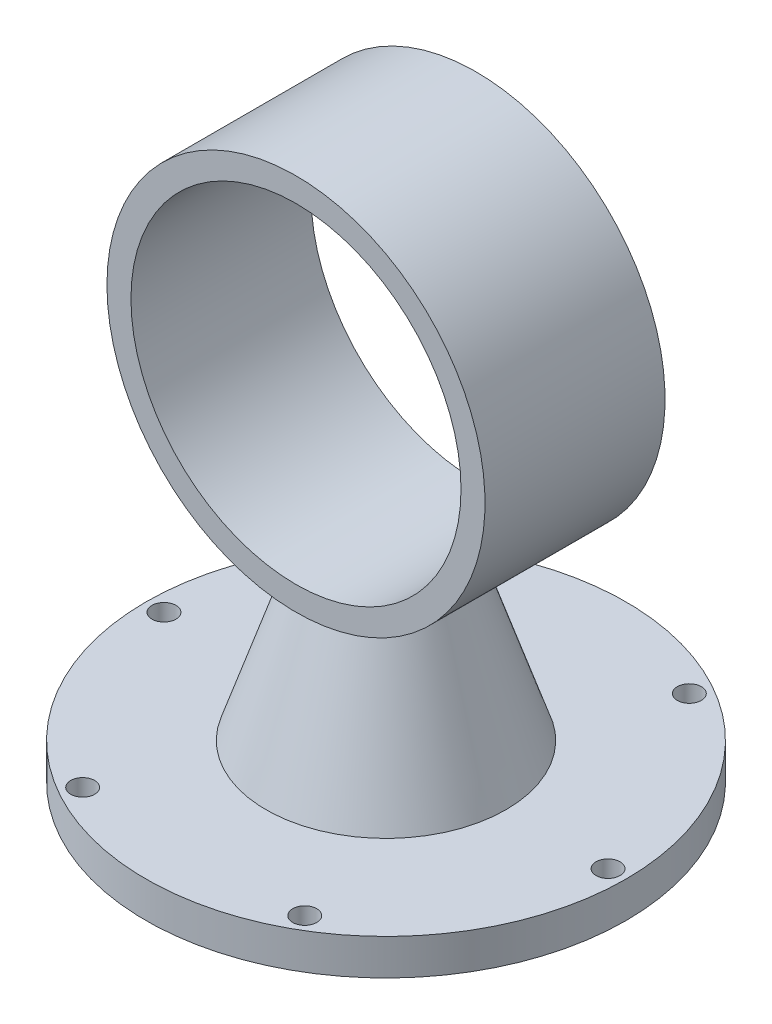
ISO-10303-21;
HEADER;
FILE_DESCRIPTION(('STEP AP214'),'2;1');
FILE_NAME('part.step','',(''),(''),'','','');
FILE_SCHEMA(('AUTOMOTIVE_DESIGN { 1 0 10303 214 1 1 1 1 }'));
ENDSEC;
DATA;
#1=APPLICATION_CONTEXT('core data for automotive mechanical design processes');
#2=APPLICATION_PROTOCOL_DEFINITION('international standard','automotive_design',2000,#1);
#3=PRODUCT_CONTEXT('',#1,'mechanical');
#4=PRODUCT('Part','Part','',(#3));
#5=PRODUCT_RELATED_PRODUCT_CATEGORY('part','',(#4));
#6=PRODUCT_DEFINITION_FORMATION('','',#4);
#7=PRODUCT_DEFINITION_CONTEXT('part definition',#1,'design');
#8=PRODUCT_DEFINITION('design','',#6,#7);
#9=PRODUCT_DEFINITION_SHAPE('','',#8);
#10=(LENGTH_UNIT() NAMED_UNIT(*) SI_UNIT(.MILLI.,.METRE.));
#11=(NAMED_UNIT(*) PLANE_ANGLE_UNIT() SI_UNIT($,.RADIAN.));
#12=(NAMED_UNIT(*) SI_UNIT($,.STERADIAN.) SOLID_ANGLE_UNIT());
#13=UNCERTAINTY_MEASURE_WITH_UNIT(LENGTH_MEASURE(1.E-05),#10,'distance_accuracy_value','');
#14=(GEOMETRIC_REPRESENTATION_CONTEXT(3) GLOBAL_UNCERTAINTY_ASSIGNED_CONTEXT((#13)) GLOBAL_UNIT_ASSIGNED_CONTEXT((#10,
#11,#12)) REPRESENTATION_CONTEXT('',''));
#15=CARTESIAN_POINT('',(0.,0.,0.));
#16=DIRECTION('',(0.,0.,1.));
#17=DIRECTION('',(1.,0.,0.));
#18=AXIS2_PLACEMENT_3D('',#15,#16,#17);
#19=CARTESIAN_POINT('',(0.,0.,0.));
#20=DIRECTION('',(0.,1.,0.));
#21=DIRECTION('',(1.,0.,0.));
#22=AXIS2_PLACEMENT_3D('',#19,#20,#21);
#23=PLANE('',#22);
#24=CARTESIAN_POINT('',(-18.5,0.,-32.0429399400242));
#25=DIRECTION('',(0.,1.,0.));
#26=DIRECTION('',(1.,0.,0.));
#27=AXIS2_PLACEMENT_3D('',#24,#25,#26);
#28=CIRCLE('',#27,2.);
#29=CARTESIAN_POINT('',(-20.5,0.,-32.0429399400242));
#30=VERTEX_POINT('',#29);
#31=EDGE_CURVE('E159',#30,#30,#28,.T.);
#32=ORIENTED_EDGE('',*,*,#31,.T.);
#33=EDGE_LOOP('',(#32));
#34=FACE_BOUND('',#33,.T.);
#35=CARTESIAN_POINT('',(-18.5,0.,32.0429399400242));
#36=DIRECTION('',(0.,1.,0.));
#37=DIRECTION('',(1.,0.,0.));
#38=AXIS2_PLACEMENT_3D('',#35,#36,#37);
#39=CIRCLE('',#38,2.);
#40=CARTESIAN_POINT('',(-20.5,0.,32.0429399400242));
#41=VERTEX_POINT('',#40);
#42=EDGE_CURVE('E104',#41,#41,#39,.T.);
#43=ORIENTED_EDGE('',*,*,#42,.T.);
#44=EDGE_LOOP('',(#43));
#45=FACE_BOUND('',#44,.T.);
#46=CARTESIAN_POINT('',(37.,0.,0.));
#47=DIRECTION('',(0.,1.,0.));
#48=DIRECTION('',(1.,0.,0.));
#49=AXIS2_PLACEMENT_3D('',#46,#47,#48);
#50=CIRCLE('',#49,2.);
#51=CARTESIAN_POINT('',(35.,0.,0.));
#52=VERTEX_POINT('',#51);
#53=EDGE_CURVE('E185',#52,#52,#50,.T.);
#54=ORIENTED_EDGE('',*,*,#53,.T.);
#55=EDGE_LOOP('',(#54));
#56=FACE_BOUND('',#55,.T.);
#57=CARTESIAN_POINT('',(18.5,0.,-32.0429399400242));
#58=DIRECTION('',(0.,1.,0.));
#59=DIRECTION('',(1.,0.,0.));
#60=AXIS2_PLACEMENT_3D('',#57,#58,#59);
#61=CIRCLE('',#60,2.);
#62=CARTESIAN_POINT('',(16.5,0.,-32.0429399400242));
#63=VERTEX_POINT('',#62);
#64=EDGE_CURVE('E74',#63,#63,#61,.T.);
#65=ORIENTED_EDGE('',*,*,#64,.T.);
#66=EDGE_LOOP('',(#65));
#67=FACE_BOUND('',#66,.T.);
#68=CARTESIAN_POINT('',(-37.,0.,0.));
#69=DIRECTION('',(0.,1.,0.));
#70=DIRECTION('',(1.,0.,0.));
#71=AXIS2_PLACEMENT_3D('',#68,#69,#70);
#72=CIRCLE('',#71,2.);
#73=CARTESIAN_POINT('',(-39.,0.,0.));
#74=VERTEX_POINT('',#73);
#75=EDGE_CURVE('E171',#74,#74,#72,.T.);
#76=ORIENTED_EDGE('',*,*,#75,.T.);
#77=EDGE_LOOP('',(#76));
#78=FACE_BOUND('',#77,.T.);
#79=CARTESIAN_POINT('',(18.5,0.,32.0429399400242));
#80=DIRECTION('',(0.,1.,0.));
#81=DIRECTION('',(1.,0.,0.));
#82=AXIS2_PLACEMENT_3D('',#79,#80,#81);
#83=CIRCLE('',#82,2.);
#84=CARTESIAN_POINT('',(16.5,0.,32.0429399400242));
#85=VERTEX_POINT('',#84);
#86=EDGE_CURVE('E173',#85,#85,#83,.T.);
#87=ORIENTED_EDGE('',*,*,#86,.T.);
#88=EDGE_LOOP('',(#87));
#89=FACE_BOUND('',#88,.T.);
#90=CARTESIAN_POINT('',(0.,0.,0.));
#91=DIRECTION('',(0.,1.,0.));
#92=DIRECTION('',(-1.,0.,0.));
#93=AXIS2_PLACEMENT_3D('',#90,#91,#92);
#94=CIRCLE('',#93,40.);
#95=CARTESIAN_POINT('',(40.,0.,0.));
#96=VERTEX_POINT('',#95);
#97=EDGE_CURVE('E11',#96,#96,#94,.T.);
#98=ORIENTED_EDGE('',*,*,#97,.F.);
#99=EDGE_LOOP('',(#98));
#100=FACE_BOUND('',#99,.T.);
#101=ADVANCED_FACE('F17',(#34,#45,#56,#67,#78,#89,#100),#23,.F.);
#102=CARTESIAN_POINT('',(0.,6.,0.));
#103=DIRECTION('',(0.,1.,0.));
#104=DIRECTION('',(1.,0.,0.));
#105=AXIS2_PLACEMENT_3D('',#102,#103,#104);
#106=PLANE('',#105);
#107=CARTESIAN_POINT('',(-18.5,6.,-32.0429399400242));
#108=DIRECTION('',(0.,-1.,0.));
#109=DIRECTION('',(1.,0.,0.));
#110=AXIS2_PLACEMENT_3D('',#107,#108,#109);
#111=CIRCLE('',#110,2.);
#112=CARTESIAN_POINT('',(-20.5,6.,-32.0429399400242));
#113=VERTEX_POINT('',#112);
#114=EDGE_CURVE('E157',#113,#113,#111,.T.);
#115=ORIENTED_EDGE('',*,*,#114,.T.);
#116=EDGE_LOOP('',(#115));
#117=FACE_BOUND('',#116,.T.);
#118=CARTESIAN_POINT('',(-18.5,6.,32.0429399400242));
#119=DIRECTION('',(0.,-1.,0.));
#120=DIRECTION('',(1.,0.,0.));
#121=AXIS2_PLACEMENT_3D('',#118,#119,#120);
#122=CIRCLE('',#121,2.);
#123=CARTESIAN_POINT('',(-20.5,6.,32.0429399400242));
#124=VERTEX_POINT('',#123);
#125=EDGE_CURVE('E182',#124,#124,#122,.T.);
#126=ORIENTED_EDGE('',*,*,#125,.T.);
#127=EDGE_LOOP('',(#126));
#128=FACE_BOUND('',#127,.T.);
#129=CARTESIAN_POINT('',(37.,6.,0.));
#130=DIRECTION('',(0.,-1.,0.));
#131=DIRECTION('',(1.,0.,0.));
#132=AXIS2_PLACEMENT_3D('',#129,#130,#131);
#133=CIRCLE('',#132,2.);
#134=CARTESIAN_POINT('',(35.,6.,0.));
#135=VERTEX_POINT('',#134);
#136=EDGE_CURVE('E192',#135,#135,#133,.T.);
#137=ORIENTED_EDGE('',*,*,#136,.T.);
#138=EDGE_LOOP('',(#137));
#139=FACE_BOUND('',#138,.T.);
#140=CARTESIAN_POINT('',(18.5,6.,-32.0429399400242));
#141=DIRECTION('',(0.,-1.,0.));
#142=DIRECTION('',(1.,0.,0.));
#143=AXIS2_PLACEMENT_3D('',#140,#141,#142);
#144=CIRCLE('',#143,2.);
#145=CARTESIAN_POINT('',(16.5,6.,-32.0429399400242));
#146=VERTEX_POINT('',#145);
#147=EDGE_CURVE('E189',#146,#146,#144,.T.);
#148=ORIENTED_EDGE('',*,*,#147,.T.);
#149=EDGE_LOOP('',(#148));
#150=FACE_BOUND('',#149,.T.);
#151=CARTESIAN_POINT('',(-37.,6.,0.));
#152=DIRECTION('',(0.,-1.,0.));
#153=DIRECTION('',(1.,0.,0.));
#154=AXIS2_PLACEMENT_3D('',#151,#152,#153);
#155=CIRCLE('',#154,2.);
#156=CARTESIAN_POINT('',(-39.,6.,0.));
#157=VERTEX_POINT('',#156);
#158=EDGE_CURVE('E172',#157,#157,#155,.T.);
#159=ORIENTED_EDGE('',*,*,#158,.T.);
#160=EDGE_LOOP('',(#159));
#161=FACE_BOUND('',#160,.T.);
#162=CARTESIAN_POINT('',(18.5,6.,32.0429399400242));
#163=DIRECTION('',(0.,-1.,0.));
#164=DIRECTION('',(1.,0.,0.));
#165=AXIS2_PLACEMENT_3D('',#162,#163,#164);
#166=CIRCLE('',#165,2.);
#167=CARTESIAN_POINT('',(16.5,6.,32.0429399400242));
#168=VERTEX_POINT('',#167);
#169=EDGE_CURVE('E180',#168,#168,#166,.T.);
#170=ORIENTED_EDGE('',*,*,#169,.T.);
#171=EDGE_LOOP('',(#170));
#172=FACE_BOUND('',#171,.T.);
#173=CARTESIAN_POINT('',(0.,6.,0.));
#174=DIRECTION('',(0.,-1.,0.));
#175=DIRECTION('',(-1.,0.,0.));
#176=AXIS2_PLACEMENT_3D('',#173,#174,#175);
#177=CIRCLE('',#176,20.);
#178=CARTESIAN_POINT('',(20.,6.,0.));
#179=VERTEX_POINT('',#178);
#180=EDGE_CURVE('E177',#179,#179,#177,.T.);
#181=ORIENTED_EDGE('',*,*,#180,.T.);
#182=EDGE_LOOP('',(#181));
#183=FACE_BOUND('',#182,.T.);
#184=CARTESIAN_POINT('',(0.,6.,0.));
#185=DIRECTION('',(0.,1.,0.));
#186=DIRECTION('',(-1.,0.,0.));
#187=AXIS2_PLACEMENT_3D('',#184,#185,#186);
#188=CIRCLE('',#187,40.);
#189=CARTESIAN_POINT('',(40.,6.,0.));
#190=VERTEX_POINT('',#189);
#191=EDGE_CURVE('E162',#190,#190,#188,.T.);
#192=ORIENTED_EDGE('',*,*,#191,.T.);
#193=EDGE_LOOP('',(#192));
#194=FACE_BOUND('',#193,.T.);
#195=ADVANCED_FACE('F432',(#117,#128,#139,#150,#161,#172,#183,#194),#106,.T.);
#196=CARTESIAN_POINT('',(0.,0.,0.));
#197=DIRECTION('',(0.,1.,0.));
#198=DIRECTION('',(-1.,0.,0.));
#199=AXIS2_PLACEMENT_3D('',#196,#197,#198);
#200=CYLINDRICAL_SURFACE('',#199,40.);
#201=ORIENTED_EDGE('',*,*,#191,.F.);
#202=DIRECTION('',(0.,-1.,0.));
#203=VECTOR('',#202,1.);
#204=CARTESIAN_POINT('',(40.,0.,0.));
#205=LINE('',#204,#203);
#206=EDGE_CURVE('E28',#190,#96,#205,.T.);
#207=ORIENTED_EDGE('',*,*,#206,.T.);
#208=ORIENTED_EDGE('',*,*,#97,.T.);
#209=ORIENTED_EDGE('',*,*,#206,.F.);
#210=EDGE_LOOP('',(#201,#207,#208,#209));
#211=FACE_BOUND('',#210,.T.);
#212=ADVANCED_FACE('F260',(#211),#200,.T.);
#213=CARTESIAN_POINT('',(-18.5,6.,-32.0429399400242));
#214=DIRECTION('',(0.,-1.,0.));
#215=DIRECTION('',(1.,0.,0.));
#216=AXIS2_PLACEMENT_3D('',#213,#214,#215);
#217=CYLINDRICAL_SURFACE('',#216,2.);
#218=ORIENTED_EDGE('',*,*,#114,.F.);
#219=DIRECTION('',(0.,-1.,0.));
#220=VECTOR('',#219,1.);
#221=CARTESIAN_POINT('',(-20.5,6.,-32.0429399400242));
#222=LINE('',#221,#220);
#223=EDGE_CURVE('E163',#113,#30,#222,.T.);
#224=ORIENTED_EDGE('',*,*,#223,.T.);
#225=ORIENTED_EDGE('',*,*,#31,.F.);
#226=ORIENTED_EDGE('',*,*,#223,.F.);
#227=EDGE_LOOP('',(#218,#224,#225,#226));
#228=FACE_BOUND('',#227,.T.);
#229=ADVANCED_FACE('F19',(#228),#217,.F.);
#230=CARTESIAN_POINT('',(-18.5,6.,32.0429399400242));
#231=DIRECTION('',(0.,-1.,0.));
#232=DIRECTION('',(1.,0.,0.));
#233=AXIS2_PLACEMENT_3D('',#230,#231,#232);
#234=CYLINDRICAL_SURFACE('',#233,2.);
#235=ORIENTED_EDGE('',*,*,#125,.F.);
#236=DIRECTION('',(0.,-1.,0.));
#237=VECTOR('',#236,1.);
#238=CARTESIAN_POINT('',(-20.5,6.,32.0429399400242));
#239=LINE('',#238,#237);
#240=EDGE_CURVE('E97',#124,#41,#239,.T.);
#241=ORIENTED_EDGE('',*,*,#240,.T.);
#242=ORIENTED_EDGE('',*,*,#42,.F.);
#243=ORIENTED_EDGE('',*,*,#240,.F.);
#244=EDGE_LOOP('',(#235,#241,#242,#243));
#245=FACE_BOUND('',#244,.T.);
#246=ADVANCED_FACE('F407',(#245),#234,.F.);
#247=CARTESIAN_POINT('',(37.,6.,0.));
#248=DIRECTION('',(0.,-1.,0.));
#249=DIRECTION('',(1.,0.,0.));
#250=AXIS2_PLACEMENT_3D('',#247,#248,#249);
#251=CYLINDRICAL_SURFACE('',#250,2.);
#252=ORIENTED_EDGE('',*,*,#136,.F.);
#253=DIRECTION('',(0.,-1.,0.));
#254=VECTOR('',#253,1.);
#255=CARTESIAN_POINT('',(35.,6.,0.));
#256=LINE('',#255,#254);
#257=EDGE_CURVE('E61',#135,#52,#256,.T.);
#258=ORIENTED_EDGE('',*,*,#257,.T.);
#259=ORIENTED_EDGE('',*,*,#53,.F.);
#260=ORIENTED_EDGE('',*,*,#257,.F.);
#261=EDGE_LOOP('',(#252,#258,#259,#260));
#262=FACE_BOUND('',#261,.T.);
#263=ADVANCED_FACE('F398',(#262),#251,.F.);
#264=CARTESIAN_POINT('',(18.5,6.,-32.0429399400242));
#265=DIRECTION('',(0.,-1.,0.));
#266=DIRECTION('',(1.,0.,0.));
#267=AXIS2_PLACEMENT_3D('',#264,#265,#266);
#268=CYLINDRICAL_SURFACE('',#267,2.);
#269=ORIENTED_EDGE('',*,*,#147,.F.);
#270=DIRECTION('',(0.,-1.,0.));
#271=VECTOR('',#270,1.);
#272=CARTESIAN_POINT('',(16.5,6.,-32.0429399400242));
#273=LINE('',#272,#271);
#274=EDGE_CURVE('E193',#146,#63,#273,.T.);
#275=ORIENTED_EDGE('',*,*,#274,.T.);
#276=ORIENTED_EDGE('',*,*,#64,.F.);
#277=ORIENTED_EDGE('',*,*,#274,.F.);
#278=EDGE_LOOP('',(#269,#275,#276,#277));
#279=FACE_BOUND('',#278,.T.);
#280=ADVANCED_FACE('F390',(#279),#268,.F.);
#281=CARTESIAN_POINT('',(-37.,6.,0.));
#282=DIRECTION('',(0.,-1.,0.));
#283=DIRECTION('',(1.,0.,0.));
#284=AXIS2_PLACEMENT_3D('',#281,#282,#283);
#285=CYLINDRICAL_SURFACE('',#284,2.);
#286=ORIENTED_EDGE('',*,*,#158,.F.);
#287=DIRECTION('',(0.,-1.,0.));
#288=VECTOR('',#287,1.);
#289=CARTESIAN_POINT('',(-39.,6.,0.));
#290=LINE('',#289,#288);
#291=EDGE_CURVE('E167',#157,#74,#290,.T.);
#292=ORIENTED_EDGE('',*,*,#291,.T.);
#293=ORIENTED_EDGE('',*,*,#75,.F.);
#294=ORIENTED_EDGE('',*,*,#291,.F.);
#295=EDGE_LOOP('',(#286,#292,#293,#294));
#296=FACE_BOUND('',#295,.T.);
#297=ADVANCED_FACE('F382',(#296),#285,.F.);
#298=CARTESIAN_POINT('',(18.5,6.,32.0429399400242));
#299=DIRECTION('',(0.,-1.,0.));
#300=DIRECTION('',(1.,0.,0.));
#301=AXIS2_PLACEMENT_3D('',#298,#299,#300);
#302=CYLINDRICAL_SURFACE('',#301,2.);
#303=ORIENTED_EDGE('',*,*,#169,.F.);
#304=DIRECTION('',(0.,-1.,0.));
#305=VECTOR('',#304,1.);
#306=CARTESIAN_POINT('',(16.5,6.,32.0429399400242));
#307=LINE('',#306,#305);
#308=EDGE_CURVE('E176',#168,#85,#307,.T.);
#309=ORIENTED_EDGE('',*,*,#308,.T.);
#310=ORIENTED_EDGE('',*,*,#86,.F.);
#311=ORIENTED_EDGE('',*,*,#308,.F.);
#312=EDGE_LOOP('',(#303,#309,#310,#311));
#313=FACE_BOUND('',#312,.T.);
#314=ADVANCED_FACE('F253',(#313),#302,.F.);
#315=CARTESIAN_POINT('',(0.,6.,0.));
#316=DIRECTION('',(0.,-1.,0.));
#317=DIRECTION('',(-1.,0.,0.));
#318=AXIS2_PLACEMENT_3D('',#315,#316,#317);
#319=CONICAL_SURFACE('',#318,20.,0.321750554396642);
#320=CARTESIAN_POINT('',(10.7080369551433,33.87588913457,0.));
#321=CARTESIAN_POINT('',(10.7080479333256,33.8758969891876,-0.177313396426435));
#322=CARTESIAN_POINT('',(10.7039544795907,33.8744135664368,-0.354617784798326));
#323=CARTESIAN_POINT('',(10.6876839746074,33.8685378655107,-0.709893767923769));
#324=CARTESIAN_POINT('',(10.6754577185806,33.8641278815491,-0.887862826354064));
#325=CARTESIAN_POINT('',(10.6429149962225,33.8524259928667,-1.24446570555335));
#326=CARTESIAN_POINT('',(10.6225316174449,33.8451102562178,-1.42309260658845));
#327=CARTESIAN_POINT('',(10.5736827137138,33.8276573951931,-1.78101652155944));
#328=CARTESIAN_POINT('',(10.5451342700297,33.8174913470375,-1.96030075561625));
#329=CARTESIAN_POINT('',(10.4794533992677,33.7942378037403,-2.32214589508347));
#330=CARTESIAN_POINT('',(10.4421091528123,33.7810785496381,-2.5046637838858));
#331=CARTESIAN_POINT('',(10.3594326453293,33.7521588095219,-2.86611501958995));
#332=CARTESIAN_POINT('',(10.3141674151128,33.7364202168213,-3.04506541731318));
#333=CARTESIAN_POINT('',(10.2156392979247,33.7024596088921,-3.39938358085693));
#334=CARTESIAN_POINT('',(10.1624244665341,33.6842525727717,-3.57476613188797));
#335=CARTESIAN_POINT('',(10.0479617341909,33.6454844005399,-3.9219466967298));
#336=CARTESIAN_POINT('',(9.9867422790348,33.6249316318058,-4.09375501746719));
#337=CARTESIAN_POINT('',(9.85634343769173,33.5816577841838,-4.43366498414948));
#338=CARTESIAN_POINT('',(9.78717937091566,33.5589408922993,-4.60177304305617));
#339=CARTESIAN_POINT('',(9.64068853419484,33.5114508260181,-4.93507589125284));
#340=CARTESIAN_POINT('',(9.56332412589944,33.4866682923816,-5.10025279289075));
#341=CARTESIAN_POINT('',(9.40038442822314,33.4352345488367,-5.4276989529024));
#342=CARTESIAN_POINT('',(9.31475472834476,33.4085713178033,-5.58993923070465));
#343=CARTESIAN_POINT('',(9.13524422146725,33.3535872583253,-5.91152271644954));
#344=CARTESIAN_POINT('',(9.04129405048143,33.3252533142561,-6.0708249185582));
#345=CARTESIAN_POINT('',(8.84912433414232,33.2683485272608,-6.38007952800198));
#346=CARTESIAN_POINT('',(8.75111584477607,33.2398099830988,-6.53016908641889));
#347=CARTESIAN_POINT('',(8.54928010435424,33.1821717168339,-6.82406627016287));
#348=CARTESIAN_POINT('',(8.44551917498165,33.1530802184825,-6.96792099419677));
#349=CARTESIAN_POINT('',(8.23215702957989,33.094511457527,-7.24935222009067));
#350=CARTESIAN_POINT('',(8.12260738503825,33.0650389405691,-7.38696877979594));
#351=CARTESIAN_POINT('',(7.89764351226046,33.0058911367504,-7.655927461335));
#352=CARTESIAN_POINT('',(7.78226579187977,32.9762179270175,-7.78730055812629));
#353=CARTESIAN_POINT('',(7.54451051979229,32.9165817737595,-8.04502957371524));
#354=CARTESIAN_POINT('',(7.42209425667117,32.8866181710423,-8.17134963671344));
#355=CARTESIAN_POINT('',(7.17092521616039,32.8268108468785,-8.41812383455945));
#356=CARTESIAN_POINT('',(7.04215936961307,32.7969675221766,-8.53856476103731));
#357=CARTESIAN_POINT('',(6.77826626163523,32.7376289103991,-8.77358906417513));
#358=CARTESIAN_POINT('',(6.64311352102923,32.7081357303371,-8.88814435988101));
#359=CARTESIAN_POINT('',(6.36643782558635,32.6497392691877,-9.11141831116271));
#360=CARTESIAN_POINT('',(6.2248787724619,32.6208411538092,-9.22009354756602));
#361=CARTESIAN_POINT('',(5.93161731873506,32.5631445011022,-9.43433400257643));
#362=CARTESIAN_POINT('',(5.7797334209477,32.5343840425768,-9.53966132185634));
#363=CARTESIAN_POINT('',(5.47255313212806,32.4786330369719,-9.74119407670401));
#364=CARTESIAN_POINT('',(5.31732549969946,32.4516245197036,-9.83749918615825));
#365=CARTESIAN_POINT('',(5.00349122684929,32.3995159176803,-10.0210058506388));
#366=CARTESIAN_POINT('',(4.84493713279585,32.374398781584,-10.108292325137));
#367=CARTESIAN_POINT('',(4.52448100975593,32.3262111299185,-10.2737756896311));
#368=CARTESIAN_POINT('',(4.36261589005084,32.3031258549365,-10.3520396816491));
#369=CARTESIAN_POINT('',(4.03351954888088,32.2588656003266,-10.5004242028295));
#370=CARTESIAN_POINT('',(3.86625820181307,32.237705483678,-10.5704824051713));
#371=CARTESIAN_POINT('',(3.52784524747805,32.1977100120299,-10.701633585672));
#372=CARTESIAN_POINT('',(3.35669093421035,32.1788763364861,-10.7627200931151));
#373=CARTESIAN_POINT('',(3.01052905008005,32.1437073954983,-10.8759533912107));
#374=CARTESIAN_POINT('',(2.83551008621384,32.1273811084144,-10.9280681331049));
#375=CARTESIAN_POINT('',(2.48166038723661,32.0974032460185,-11.0233825474589));
#376=CARTESIAN_POINT('',(2.30281269055253,32.083768980599,-11.0665246138836));
#377=CARTESIAN_POINT('',(1.94634376257903,32.059690541832,-11.1428524698117));
#378=CARTESIAN_POINT('',(1.76876328467168,32.0491909231418,-11.1762110934471));
#379=CARTESIAN_POINT('',(1.41394051065902,32.0312540829424,-11.2333020652643));
#380=CARTESIAN_POINT('',(1.23671658108269,32.0237839742259,-11.2571377462249));
#381=CARTESIAN_POINT('',(0.882671127776161,32.0118753394354,-11.2952019177312));
#382=CARTESIAN_POINT('',(0.705859141395875,32.0074114146699,-11.3095108856968));
#383=CARTESIAN_POINT('',(0.352695951237082,32.0014823703463,-11.3285479574832));
#384=CARTESIAN_POINT('',(0.176348027375054,31.999999999547,-11.3333311755978));
#385=CARTESIAN_POINT('',(-0.176293893594131,32.0000000004529,-11.3333354904064));
#386=CARTESIAN_POINT('',(-0.352587890637746,32.0014814622069,-11.3285595219463));
#387=CARTESIAN_POINT('',(-0.705679276033871,32.0074074843161,-11.3095321148699));
#388=CARTESIAN_POINT('',(-0.882473268649289,32.0118698963105,-11.2952235912451));
#389=CARTESIAN_POINT('',(-1.23651871094069,32.0237760974024,-11.2571584896992));
#390=CARTESIAN_POINT('',(-1.41376039595699,32.0312458854391,-11.2333195335723));
#391=CARTESIAN_POINT('',(-1.76865540718399,32.0491845524697,-11.1762226538987));
#392=CARTESIAN_POINT('',(-1.94629005284703,32.0596869132264,-11.1428596273775));
#393=CARTESIAN_POINT('',(-2.30275941880898,32.0837653829297,-11.0665404444539));
#394=CARTESIAN_POINT('',(-2.48155467386574,32.0973951946156,-11.0234168862938));
#395=CARTESIAN_POINT('',(-2.83533466856254,32.1273653487889,-10.9281271363518));
#396=CARTESIAN_POINT('',(-3.01033582994962,32.143688945557,-10.8760167257477));
#397=CARTESIAN_POINT('',(-3.35649765414154,32.178855524513,-10.7627825299699));
#398=CARTESIAN_POINT('',(-3.52766904946751,32.1976900495255,-10.7016889333156));
#399=CARTESIAN_POINT('',(-3.86615300795071,32.2376921909914,-10.5705167246888));
#400=CARTESIAN_POINT('',(-4.03346751242008,32.2588586012826,-10.5004427547594));
#401=CARTESIAN_POINT('',(-4.36256727744909,32.3031193176562,-10.3520664729524));
#402=CARTESIAN_POINT('',(-4.52438524309917,32.3261974857826,-10.2738318317463));
#403=CARTESIAN_POINT('',(-4.84477876783694,32.3743742057794,-10.1083875747148));
#404=CARTESIAN_POINT('',(-5.00331645683526,32.3994878845697,-10.0211091018739));
#405=CARTESIAN_POINT('',(-5.31715060934875,32.4515944862156,-9.83760163737891));
#406=CARTESIAN_POINT('',(-5.47239351453107,32.4786047879288,-9.74128609536953));
#407=CARTESIAN_POINT('',(-5.77963837151639,32.5343660623466,-9.53971743956166));
#408=CARTESIAN_POINT('',(-5.93157054484862,32.5631352984011,-9.4343631768393));
#409=CARTESIAN_POINT('',(-6.22483747076943,32.6208330283908,-9.22012854634053));
#410=CARTESIAN_POINT('',(-6.36635691236794,32.6497227664965,-9.11149027917623));
#411=CARTESIAN_POINT('',(-6.64298004115787,32.7081069862677,-8.88826556339361));
#412=CARTESIAN_POINT('',(-6.77811873896784,32.7375964677432,-8.77372122980257));
#413=CARTESIAN_POINT('',(-7.0420116163127,32.7969335733702,-8.5386962891552));
#414=CARTESIAN_POINT('',(-7.17079009312806,32.8267791885469,-8.41824245930042));
#415=CARTESIAN_POINT('',(-7.42201404325888,32.8865985558537,-8.17142159891299));
#416=CARTESIAN_POINT('',(-7.54447133977827,32.9165719461569,-8.04506651723069));
#417=CARTESIAN_POINT('',(-7.78223203111058,32.9762094588833,-7.78734264594122));
#418=CARTESIAN_POINT('',(-7.89757800629916,33.005874305421,-7.65601329848522));
#419=CARTESIAN_POINT('',(-8.12249977899409,33.0650102550364,-7.38711292415553));
#420=CARTESIAN_POINT('',(-8.2320377248427,33.0944791982057,-7.24950977970292));
#421=CARTESIAN_POINT('',(-8.44539949365,33.1530468718259,-6.96807803673746));
#422=CARTESIAN_POINT('',(-8.54917039880603,33.1821407326374,-6.82420833656968));
#423=CARTESIAN_POINT('',(-8.75105089978029,33.2397910890235,-6.53025492390003));
#424=CARTESIAN_POINT('',(-8.84909286452904,33.2683392087487,-6.38012318314155));
#425=CARTESIAN_POINT('',(-9.04126795429504,33.3252455865305,-6.07087411345));
#426=CARTESIAN_POINT('',(-9.13519420657895,33.3535721890567,-5.91162234148598));
#427=CARTESIAN_POINT('',(-9.31467298348182,33.408546031378,-5.59010605512496));
#428=CARTESIAN_POINT('',(-9.40029341370762,33.4352061172405,-5.4278816869589));
#429=CARTESIAN_POINT('',(-9.56323254067036,33.4866390866673,-5.10043513099828));
#430=CARTESIAN_POINT('',(-9.64060408881831,33.5114236470496,-4.93524109175054));
#431=CARTESIAN_POINT('',(-9.78712971975674,33.5589246003417,-4.60187266566742));
#432=CARTESIAN_POINT('',(-9.85631981907668,33.5816499464293,-4.43371539610361));
#433=CARTESIAN_POINT('',(-9.98672612828746,33.6249262717944,-4.09380828648292));
#434=CARTESIAN_POINT('',(-10.0479319409195,33.6454744094712,-3.92205409346715));
#435=CARTESIAN_POINT('',(-10.1623765587797,33.6842362464036,-3.57494565019346));
#436=CARTESIAN_POINT('',(-10.2155852400814,33.7024410836043,-3.39958048422141));
#437=CARTESIAN_POINT('',(-10.3141126023139,33.7364012161361,-3.04526206266195));
#438=CARTESIAN_POINT('',(-10.359381564942,33.7521410140618,-2.86629351171467));
#439=CARTESIAN_POINT('',(-10.4420795438999,33.7810681198645,-2.50477117519621));
#440=CARTESIAN_POINT('',(-10.4794399283218,33.7942330130716,-2.32219993021208));
#441=CARTESIAN_POINT('',(-10.5451255163147,33.817488268745,-1.96036861317718));
#442=CARTESIAN_POINT('',(-10.5736678783876,33.8276521959889,-1.78115264934448));
#443=CARTESIAN_POINT('',(-10.6225081916301,33.8451017864939,-1.42331943663123));
#444=CARTESIAN_POINT('',(-10.6428871357859,33.8524157051168,-1.24471467448813));
#445=CARTESIAN_POINT('',(-10.6754305711669,33.8641183860838,-0.88811249759152));
#446=CARTESIAN_POINT('',(-10.6876599047887,33.8685302350249,-0.710121778273542));
#447=CARTESIAN_POINT('',(-10.7039362783741,33.8744059435895,-0.354752492019096));
#448=CARTESIAN_POINT('',(-10.708030474139,33.8758867927286,-0.177376382092896));
#449=CARTESIAN_POINT('',(-10.7080434321597,33.8758914749705,0.177267238065344));
#450=CARTESIAN_POINT('',(-10.7039672234098,33.8744171270367,0.354534747962544));
#451=CARTESIAN_POINT('',(-10.6877143388806,33.8685498732283,0.709759336269914));
#452=CARTESIAN_POINT('',(-10.6754871075813,33.8641387526752,0.887713783486938));
#453=CARTESIAN_POINT('',(-10.6429421953682,33.8524354685233,1.24431596292034));
#454=CARTESIAN_POINT('',(-10.6225563770471,33.8451190450538,1.42295665611364));
#455=CARTESIAN_POINT('',(-10.5736985619938,33.8276631154151,1.78093523570982));
#456=CARTESIAN_POINT('',(-10.5451424316941,33.8174942589395,1.96026015179427));
#457=CARTESIAN_POINT('',(-10.4794526174199,33.7942375039747,2.32214572523082));
#458=CARTESIAN_POINT('',(-10.4421089441373,33.7810784696311,2.5046637386238));
#459=CARTESIAN_POINT('',(-10.3594328522805,33.7521588888693,2.8661150646978));
#460=CARTESIAN_POINT('',(-10.3141674703895,33.7364202380157,3.04506542947629));
#461=CARTESIAN_POINT('',(-10.2156392429199,33.7024595878039,3.39938356905624));
#462=CARTESIAN_POINT('',(-10.1624244518055,33.6842525671256,3.57476612882566));
#463=CARTESIAN_POINT('',(-10.0479617488342,33.6454844061549,3.92194669999475));
#464=CARTESIAN_POINT('',(-9.98674228295185,33.624931633308,4.09375501835983));
#465=CARTESIAN_POINT('',(-9.85634343375506,33.5816577826754,4.43366498332988));
#466=CARTESIAN_POINT('',(-9.78717936982235,33.5589408918824,4.60177304288959));
#467=CARTESIAN_POINT('',(-9.64068853518262,33.5114508264011,4.93507589158547));
#468=CARTESIAN_POINT('',(-9.56332412610857,33.4866682924666,5.10025279306627));
#469=CARTESIAN_POINT('',(-9.40038442786192,33.4352345487035,5.427698952954));
#470=CARTESIAN_POINT('',(-9.31475472819986,33.4085713177528,5.58993923079153));
#471=CARTESIAN_POINT('',(-9.13524422150372,33.3535872583427,5.9115227165284));
#472=CARTESIAN_POINT('',(-9.04129405048149,33.3252533142579,6.07082491859383));
#473=CARTESIAN_POINT('',(-8.84912433414311,33.2683485272593,6.38007952796557));
#474=CARTESIAN_POINT('',(-8.75111584481197,33.2398099831087,6.53016908635326));
#475=CARTESIAN_POINT('',(-8.54928010442884,33.1821717168555,6.82406627005683));
#476=CARTESIAN_POINT('',(-8.44551917505908,33.1530802185043,6.96792099407889));
#477=CARTESIAN_POINT('',(-8.23215702965444,33.094511457547,7.24935221997185));
#478=CARTESIAN_POINT('',(-8.12260738510607,33.0650389405871,7.38696877968727));
#479=CARTESIAN_POINT('',(-7.89764351230222,33.0058911367612,7.65592746127022));
#480=CARTESIAN_POINT('',(-7.78226579190122,32.9762179270229,7.78730055809444));
#481=CARTESIAN_POINT('',(-7.54451051982214,32.916581773767,8.04502957369126));
#482=CARTESIAN_POINT('',(-7.42209425673245,32.8866181710573,8.17134963666695));
#483=CARTESIAN_POINT('',(-7.17092521626349,32.8268108469027,8.41812383448274));
#484=CARTESIAN_POINT('',(-7.04215936972567,32.7969675222025,8.53856476095201));
#485=CARTESIAN_POINT('',(-6.77826626174768,32.7376289104238,8.77358906408949));
#486=CARTESIAN_POINT('',(-6.64311352113119,32.708135730359,8.88814435980267));
#487=CARTESIAN_POINT('',(-6.36643782564805,32.6497392692003,9.11141831111623));
#488=CARTESIAN_POINT('',(-6.22487877249304,32.6208411538153,9.22009354754314));
#489=CARTESIAN_POINT('',(-5.93161731874257,32.5631445011036,9.43433400257113));
#490=CARTESIAN_POINT('',(-5.77973342096358,32.5343840425798,9.53966132184689));
#491=CARTESIAN_POINT('',(-5.47255313215495,32.4786330369767,9.74119407668881));
#492=CARTESIAN_POINT('',(-5.31732549972884,32.4516245197087,9.83749918614121));
#493=CARTESIAN_POINT('',(-5.00349122687858,32.399515917685,10.0210058506216));
#494=CARTESIAN_POINT('',(-4.84493713282239,32.3743987815881,10.1082923251211));
#495=CARTESIAN_POINT('',(-4.52448100977197,32.3262111299208,10.2737756896217));
#496=CARTESIAN_POINT('',(-4.36261589005898,32.3031258549376,10.3520396816447));
#497=CARTESIAN_POINT('',(-4.03351954889006,32.2588656003278,10.5004242028262));
#498=CARTESIAN_POINT('',(-3.86625820183164,32.2377054836804,10.5704824051651));
#499=CARTESIAN_POINT('',(-3.52784524750917,32.1977100120335,10.701633585662));
#500=CARTESIAN_POINT('',(-3.35669093424449,32.1788763364898,10.7627200931037));
#501=CARTESIAN_POINT('',(-3.01052905011421,32.1437073955015,10.8759533911992));
#502=CARTESIAN_POINT('',(-2.83551008624487,32.1273811084172,10.9280681330942));
#503=CARTESIAN_POINT('',(-2.48166038725531,32.0974032460199,11.0233825474527));
#504=CARTESIAN_POINT('',(-2.30281269056194,32.0837689805996,11.0665246138806));
#505=CARTESIAN_POINT('',(-1.94634376258156,32.0596905418322,11.1428524698122));
#506=CARTESIAN_POINT('',(-1.76876328467677,32.0491909231421,11.1762110934484));
#507=CARTESIAN_POINT('',(-1.41394051066749,32.0312540829428,11.2333020652666));
#508=CARTESIAN_POINT('',(-1.23671658109197,32.0237839742262,11.2571377462272));
#509=CARTESIAN_POINT('',(-0.882671127785416,32.0118753394357,11.2952019177334));
#510=CARTESIAN_POINT('',(-0.705859141404284,32.0074114146701,11.3095108856988));
#511=CARTESIAN_POINT('',(-0.352695951242123,32.0014823703463,11.3285479574845));
#512=CARTESIAN_POINT('',(-0.176348027377568,31.999999999547,11.3333311755985));
#513=CARTESIAN_POINT('',(0.176293893593043,32.0000000004529,11.3333354904057));
#514=CARTESIAN_POINT('',(0.352587890635558,32.0014814622069,11.328559521945));
#515=CARTESIAN_POINT('',(0.705679276030207,32.007407484316,11.3095321148679));
#516=CARTESIAN_POINT('',(0.882473268645248,32.0118698963104,11.2952235912429));
#517=CARTESIAN_POINT('',(1.23651871093661,32.0237760974022,11.257158489697));
#518=CARTESIAN_POINT('',(1.41376039595325,32.0312458854389,11.2333195335702));
#519=CARTESIAN_POINT('',(1.76865540718172,32.0491845524696,11.1762226538974));
#520=CARTESIAN_POINT('',(1.9462900528459,32.0596869132263,11.1428596273769));
#521=CARTESIAN_POINT('',(2.30275941880322,32.0837653829294,11.0665404444559));
#522=CARTESIAN_POINT('',(2.48155467385427,32.0973951946147,11.0234168862979));
#523=CARTESIAN_POINT('',(2.83533466854351,32.1273653487871,10.9281271363588));
#524=CARTESIAN_POINT('',(3.01033582992866,32.143688945555,10.8760167257552));
#525=CARTESIAN_POINT('',(3.35649765412059,32.1788555245107,10.7627825299773));
#526=CARTESIAN_POINT('',(3.52766904944843,32.1976900495233,10.7016889333222));
#527=CARTESIAN_POINT('',(3.86615300793934,32.23769219099,10.5705167246929));
#528=CARTESIAN_POINT('',(4.03346751241446,32.2588586012819,10.5004427547616));
#529=CARTESIAN_POINT('',(4.36256727744502,32.3031193176557,10.3520664729546));
#530=CARTESIAN_POINT('',(4.52438524309114,32.3261974857815,10.273831831751));
#531=CARTESIAN_POINT('',(4.84477876782366,32.3743742057773,10.1083875747227));
#532=CARTESIAN_POINT('',(5.00331645682061,32.3994878845674,10.0211091018825));
#533=CARTESIAN_POINT('',(5.31715060933408,32.4515944862131,9.83760163738744));
#534=CARTESIAN_POINT('',(5.47239351451768,32.4786047879264,9.7412860953772));
#535=CARTESIAN_POINT('',(5.77963837150842,32.5343660623451,9.53971743956633));
#536=CARTESIAN_POINT('',(5.93157054484471,32.5631352984003,9.43436317684172));
#537=CARTESIAN_POINT('',(6.22483747076619,32.6208330283901,9.22012854634332));
#538=CARTESIAN_POINT('',(6.36635691236158,32.6497227664952,9.11149027918198));
#539=CARTESIAN_POINT('',(6.64298004114738,32.7081069862654,8.88826556340333));
#540=CARTESIAN_POINT('',(6.77811873895627,32.7375964677407,8.7737212298132));
#541=CARTESIAN_POINT('',(7.04201161630105,32.7969335733675,8.53869628916573));
#542=CARTESIAN_POINT('',(7.17079009311733,32.8267791885444,8.41824245930983));
#543=CARTESIAN_POINT('',(7.42201404325268,32.8865985558521,8.1714215989189));
#544=CARTESIAN_POINT('',(7.54447133977558,32.9165719461563,8.04506651723412));
#545=CARTESIAN_POINT('',(7.78223203108299,32.9762094588764,7.78734264597064));
#546=CARTESIAN_POINT('',(7.89757800624476,33.0058743054071,7.6560132985446));
#547=CARTESIAN_POINT('',(8.12249977890367,33.0650102550123,7.38711292425513));
#548=CARTESIAN_POINT('',(8.23203772474206,33.0944791981785,7.24950977981194));
#549=CARTESIAN_POINT('',(8.44539949355143,33.1530468717985,6.96807803684659));
#550=CARTESIAN_POINT('',(8.54917039871878,33.182140732613,6.82420833666873));
#551=CARTESIAN_POINT('',(8.75105089972156,33.2397910890063,6.53025492395877));
#552=CARTESIAN_POINT('',(8.8490928644864,33.2683392087357,6.38012318316938));
#553=CARTESIAN_POINT('',(9.04126795427612,33.3252455865253,6.07087411352312));
#554=CARTESIAN_POINT('',(9.13519420657394,33.3535721890566,5.91162234163852));
#555=CARTESIAN_POINT('',(9.31467298330108,33.4085460313213,5.59010605535031));
#556=CARTESIAN_POINT('',(9.40029341333722,33.4352061171225,5.42788168717675));
#557=CARTESIAN_POINT('',(9.56323254078062,33.4866390867032,5.10043513129772));
#558=CARTESIAN_POINT('',(9.64060408959097,33.5114236472983,4.93524109213691));
#559=CARTESIAN_POINT('',(9.78712971879823,33.5589246000327,4.60187266565723));
#560=CARTESIAN_POINT('',(9.85631981573643,33.5816499453539,4.43371539561123));
#561=CARTESIAN_POINT('',(9.98672613157315,33.6249262728517,4.09380828712874));
#562=CARTESIAN_POINT('',(10.0479319532349,33.6454744134345,3.92205409573892));
#563=CARTESIAN_POINT('',(10.1623765462965,33.6842362423842,3.57494564835095));
#564=CARTESIAN_POINT('',(10.2155851936095,33.7024410686447,3.39958047661083));
#565=CARTESIAN_POINT('',(10.3141126488956,33.7364012311272,3.04526207091991));
#566=CARTESIAN_POINT('',(10.3593817395395,33.7521410702573,2.86629354177492));
#567=CARTESIAN_POINT('',(10.4420793677167,33.7810680631551,2.50477114532271));
#568=CARTESIAN_POINT('',(10.4794392682628,33.7942328006179,2.32219981773616));
#569=CARTESIAN_POINT('',(10.5451335643379,33.8174910973955,1.96032792818615));
#570=CARTESIAN_POINT('',(10.5736832972093,33.8276576055738,1.78107110650933));
#571=CARTESIAN_POINT('',(10.6225334100512,33.8451108947965,1.42318360719491));
#572=CARTESIAN_POINT('',(10.6429159837972,33.8524263470944,1.24456559962093));
#573=CARTESIAN_POINT('',(10.6754583718019,33.8641281173205,0.887962609047672));
#574=CARTESIAN_POINT('',(10.6876842999446,33.8685379828356,0.709984462351287));
#575=CARTESIAN_POINT('',(10.7039549890886,33.8744137505916,0.354672188593714));
#576=CARTESIAN_POINT('',(10.7080481297493,33.8758970617064,0.177340555215748));
#577=CARTESIAN_POINT('',(10.7080369551433,33.87588913457,0.));
#578=B_SPLINE_CURVE_WITH_KNOTS('',3,(#320,#321,#322,#323,#324,#325,#326,#327,#328,#329,#330,
#331,#332,#333,#334,#335,#336,#337,#338,#339,#340,#341,#342,#343,#344,#345,#346,#347,#348,#349,
#350,#351,#352,#353,#354,#355,#356,#357,#358,#359,#360,#361,#362,#363,#364,#365,#366,#367,#368,
#369,#370,#371,#372,#373,#374,#375,#376,#377,#378,#379,#380,#381,#382,#383,#384,#385,#386,#387,
#388,#389,#390,#391,#392,#393,#394,#395,#396,#397,#398,#399,#400,#401,#402,#403,#404,#405,#406,
#407,#408,#409,#410,#411,#412,#413,#414,#415,#416,#417,#418,#419,#420,#421,#422,#423,#424,#425,
#426,#427,#428,#429,#430,#431,#432,#433,#434,#435,#436,#437,#438,#439,#440,#441,#442,#443,#444,
#445,#446,#447,#448,#449,#450,#451,#452,#453,#454,#455,#456,#457,#458,#459,#460,#461,#462,#463,
#464,#465,#466,#467,#468,#469,#470,#471,#472,#473,#474,#475,#476,#477,#478,#479,#480,#481,#482,
#483,#484,#485,#486,#487,#488,#489,#490,#491,#492,#493,#494,#495,#496,#497,#498,#499,#500,#501,
#502,#503,#504,#505,#506,#507,#508,#509,#510,#511,#512,#513,#514,#515,#516,#517,#518,#519,#520,
#521,#522,#523,#524,#525,#526,#527,#528,#529,#530,#531,#532,#533,#534,#535,#536,#537,#538,#539,
#540,#541,#542,#543,#544,#545,#546,#547,#548,#549,#550,#551,#552,#553,#554,#555,#556,#557,#558,
#559,#560,#561,#562,#563,#564,#565,#566,#567,#568,#569,#570,#571,#572,#573,#574,#575,#576,#577),
.UNSPECIFIED.,.F.,.F.,(4,2,2,2,2,2,2,2,2,2,2,2,2,2,2,2,2,2,2,2,2,2,2,2,2,2,2,2,2,2,2,2,2,2,2,2,
2,2,2,2,2,2,2,2,2,2,2,2,2,2,2,2,2,2,2,2,2,2,2,2,2,2,2,2,2,2,2,2,2,2,2,2,2,2,2,2,2,2,2,2,2,2,2,2,
2,2,2,2,2,2,2,2,2,2,2,2,2,2,2,2,2,2,2,2,2,2,2,2,2,2,2,2,2,2,2,2,2,2,2,2,2,2,2,2,2,2,2,2,4),(0.,
0.531873129483041,1.06699380672835,1.60659710312335,2.15188763012596,2.71196790638387,
3.26751950184409,3.81983935266278,4.37024723609419,4.91961105510783,5.47161555080662,
6.02754030150271,6.58863805837485,7.13299253214061,7.67202041597498,8.20686525323883,
8.73869756798072,9.27380316049248,9.810060291158,10.3486750924317,10.8908379571697,
11.4517693998508,12.0055060203408,12.5534323323975,13.0969772509019,13.6444143837835,
14.192244429685,14.7419925497863,15.2951680393327,15.8378837761104,16.3745392479881,
16.9066017426424,17.4355767695714,17.9643894163556,18.4963976302617,19.033107382393,
19.5759855183518,20.1289944635214,20.6786869210265,21.2265726253671,21.7741762559776,
22.3175540584627,22.8654245108472,23.4192169983051,23.9803156496951,24.5223147266121,
25.0608748086415,25.5971866616976,26.1324560609261,26.6641249380299,27.1989151778563,
27.7379976571718,28.2825155676316,28.8434450849489,29.3993136355924,29.9513743259368,
30.5009063199114,31.0511469271942,31.6034108814677,32.1590183771924,32.7192659770191,
33.2643514066313,33.8038862450274,34.3390753200918,34.8711529836614,35.4029032468267,
35.9379826850183,36.4776274055491,37.0230424752121,37.5831227515914,38.138674347092,
38.6909941978705,39.2414020811822,39.790765900307,40.3427703960431,40.8986951467017,
41.459792903461,42.0041473771104,42.543175260906,43.0780200982085,43.6098524130655,
44.144958005461,44.6812151360875,45.2198299374003,45.7619928022557,46.3229242449088,
46.8766608653894,47.4245871774555,47.9681320959879,48.51556922884,49.0633992747316,
49.6131473948428,50.1663228844187,50.7090386211892,51.2456940930645,51.7777565877213,
52.3067316146578,52.8355442614388,53.3675524753438,53.904262227476,54.4471403634378,
55.0001493085893,55.5498417660883,56.097727470435,56.6453311010638,57.1887089035349,
57.7365793559146,58.2903718433772,58.8514704947813,59.3934695716852,59.9320296537103,
60.4683415067707,61.0036109060123,61.5352797829932,62.0700700227788,62.609152502135,
63.1536704127162,63.714599929795,64.2704684803589,64.8225291707829,65.3720611649957,
65.9223017720231,66.4745657262112,67.0301732220213,67.5904208221032,68.1356308720528,
68.6752071603308,69.210354970761,69.7423096913875),.UNSPECIFIED.);
#579=CARTESIAN_POINT('',(10.7080369551433,33.87588913457,0.));
#580=VERTEX_POINT('',#579);
#581=EDGE_CURVE('E142',#580,#580,#578,.T.);
#582=ORIENTED_EDGE('',*,*,#581,.F.);
#583=DIRECTION('',(0.316227766016838,-0.948683298050514,0.));
#584=VECTOR('',#583,1.);
#585=CARTESIAN_POINT('',(20.,6.,0.));
#586=LINE('',#585,#584);
#587=EDGE_CURVE('E181',#580,#179,#586,.T.);
#588=ORIENTED_EDGE('',*,*,#587,.T.);
#589=ORIENTED_EDGE('',*,*,#180,.F.);
#590=ORIENTED_EDGE('',*,*,#587,.F.);
#591=EDGE_LOOP('',(#582,#588,#589,#590));
#592=FACE_BOUND('',#591,.T.);
#593=ADVANCED_FACE('F255',(#592),#319,.T.);
#594=CARTESIAN_POINT('',(0.,63.5,15.));
#595=DIRECTION('',(0.,0.,1.));
#596=DIRECTION('',(1.,0.,0.));
#597=AXIS2_PLACEMENT_3D('',#594,#595,#596);
#598=PLANE('',#597);
#599=CARTESIAN_POINT('',(0.,63.5,15.));
#600=DIRECTION('',(0.,0.,-1.));
#601=DIRECTION('',(-1.,0.,0.));
#602=AXIS2_PLACEMENT_3D('',#599,#600,#601);
#603=CIRCLE('',#602,27.5);
#604=CARTESIAN_POINT('',(27.5,63.5,15.));
#605=VERTEX_POINT('',#604);
#606=EDGE_CURVE('E153',#605,#605,#603,.T.);
#607=ORIENTED_EDGE('',*,*,#606,.T.);
#608=EDGE_LOOP('',(#607));
#609=FACE_BOUND('',#608,.T.);
#610=CARTESIAN_POINT('',(0.,63.5,15.));
#611=DIRECTION('',(0.,0.,1.));
#612=DIRECTION('',(1.,0.,0.));
#613=AXIS2_PLACEMENT_3D('',#610,#611,#612);
#614=CIRCLE('',#613,31.5);
#615=CARTESIAN_POINT('',(-31.5,63.5,15.));
#616=VERTEX_POINT('',#615);
#617=EDGE_CURVE('E138',#616,#616,#614,.T.);
#618=ORIENTED_EDGE('',*,*,#617,.T.);
#619=EDGE_LOOP('',(#618));
#620=FACE_BOUND('',#619,.T.);
#621=ADVANCED_FACE('F145',(#609,#620),#598,.T.);
#622=CARTESIAN_POINT('',(0.,63.5,0.));
#623=DIRECTION('',(0.,0.,1.));
#624=DIRECTION('',(1.,0.,0.));
#625=AXIS2_PLACEMENT_3D('',#622,#623,#624);
#626=CYLINDRICAL_SURFACE('',#625,31.5);
#627=ORIENTED_EDGE('',*,*,#581,.T.);
#628=EDGE_LOOP('',(#627));
#629=FACE_BOUND('',#628,.T.);
#630=ORIENTED_EDGE('',*,*,#617,.F.);
#631=DIRECTION('',(0.,0.,-1.));
#632=VECTOR('',#631,1.);
#633=CARTESIAN_POINT('',(-31.5,63.5,0.));
#634=LINE('',#633,#632);
#635=CARTESIAN_POINT('',(-31.5,63.5,-15.));
#636=VERTEX_POINT('',#635);
#637=EDGE_CURVE('E135',#616,#636,#634,.T.);
#638=ORIENTED_EDGE('',*,*,#637,.T.);
#639=CARTESIAN_POINT('',(0.,63.5,-15.));
#640=DIRECTION('',(0.,0.,-1.));
#641=DIRECTION('',(1.,0.,0.));
#642=AXIS2_PLACEMENT_3D('',#639,#640,#641);
#643=CIRCLE('',#642,31.5);
#644=EDGE_CURVE('E140',#636,#636,#643,.T.);
#645=ORIENTED_EDGE('',*,*,#644,.F.);
#646=ORIENTED_EDGE('',*,*,#637,.F.);
#647=EDGE_LOOP('',(#630,#638,#645,#646));
#648=FACE_BOUND('',#647,.T.);
#649=ADVANCED_FACE('F137',(#629,#648),#626,.T.);
#650=CARTESIAN_POINT('',(0.,63.5,0.));
#651=DIRECTION('',(0.,0.,1.));
#652=DIRECTION('',(-1.,0.,0.));
#653=AXIS2_PLACEMENT_3D('',#650,#651,#652);
#654=CYLINDRICAL_SURFACE('',#653,27.5);
#655=ORIENTED_EDGE('',*,*,#606,.F.);
#656=DIRECTION('',(0.,0.,-1.));
#657=VECTOR('',#656,1.);
#658=CARTESIAN_POINT('',(27.5,63.5,0.));
#659=LINE('',#658,#657);
#660=CARTESIAN_POINT('',(27.5,63.5,-15.));
#661=VERTEX_POINT('',#660);
#662=EDGE_CURVE('E147',#605,#661,#659,.T.);
#663=ORIENTED_EDGE('',*,*,#662,.T.);
#664=CARTESIAN_POINT('',(0.,63.5,-15.));
#665=DIRECTION('',(0.,0.,1.));
#666=DIRECTION('',(-1.,0.,0.));
#667=AXIS2_PLACEMENT_3D('',#664,#665,#666);
#668=CIRCLE('',#667,27.5);
#669=EDGE_CURVE('E201',#661,#661,#668,.T.);
#670=ORIENTED_EDGE('',*,*,#669,.F.);
#671=ORIENTED_EDGE('',*,*,#662,.F.);
#672=EDGE_LOOP('',(#655,#663,#670,#671));
#673=FACE_BOUND('',#672,.T.);
#674=ADVANCED_FACE('F252',(#673),#654,.F.);
#675=CARTESIAN_POINT('',(0.,63.5,-15.));
#676=DIRECTION('',(0.,0.,1.));
#677=DIRECTION('',(1.,0.,0.));
#678=AXIS2_PLACEMENT_3D('',#675,#676,#677);
#679=PLANE('',#678);
#680=ORIENTED_EDGE('',*,*,#669,.T.);
#681=EDGE_LOOP('',(#680));
#682=FACE_BOUND('',#681,.T.);
#683=ORIENTED_EDGE('',*,*,#644,.T.);
#684=EDGE_LOOP('',(#683));
#685=FACE_BOUND('',#684,.T.);
#686=ADVANCED_FACE('F331',(#682,#685),#679,.F.);
#687=CLOSED_SHELL('',(#101,#195,#212,#229,#246,#263,#280,#297,#314,#593,#621,#649,#674,#686));
#688=MANIFOLD_SOLID_BREP('B1',#687);
#689=ADVANCED_BREP_SHAPE_REPRESENTATION('',(#18,#688),#14);
#690=SHAPE_DEFINITION_REPRESENTATION(#9,#689);
ENDSEC;
END-ISO-10303-21;
